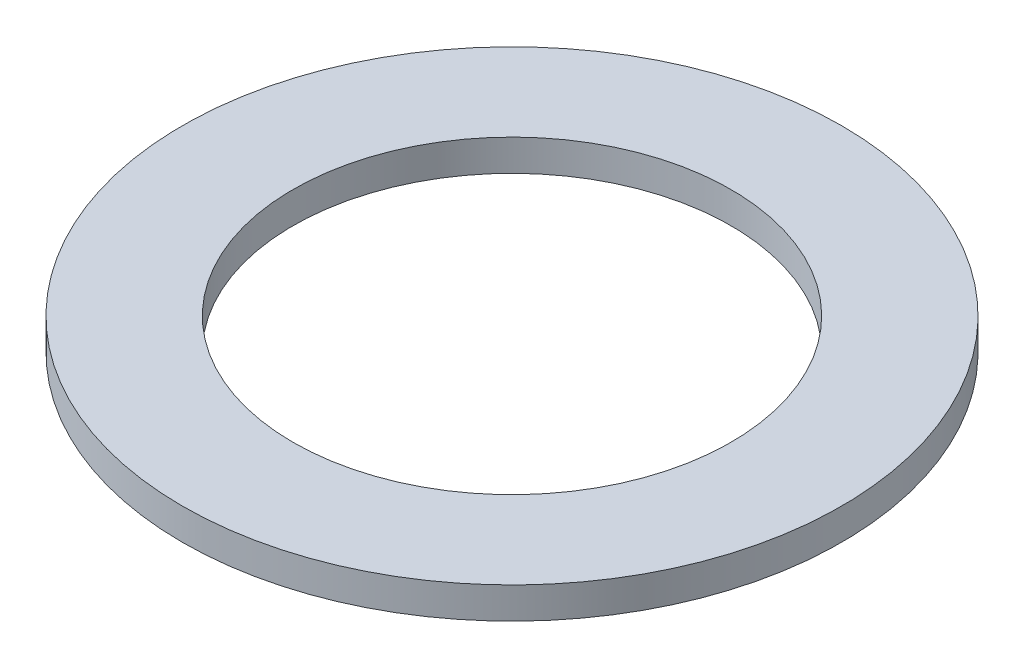
ISO-10303-21;
HEADER;
FILE_DESCRIPTION(('STEP AP214'),'2;1');
FILE_NAME('part.step','',(''),(''),'','','');
FILE_SCHEMA(('AUTOMOTIVE_DESIGN { 1 0 10303 214 1 1 1 1 }'));
ENDSEC;
DATA;
#1=APPLICATION_CONTEXT('core data for automotive mechanical design processes');
#2=APPLICATION_PROTOCOL_DEFINITION('international standard','automotive_design',2000,#1);
#3=PRODUCT_CONTEXT('',#1,'mechanical');
#4=PRODUCT('Part','Part','',(#3));
#5=PRODUCT_RELATED_PRODUCT_CATEGORY('part','',(#4));
#6=PRODUCT_DEFINITION_FORMATION('','',#4);
#7=PRODUCT_DEFINITION_CONTEXT('part definition',#1,'design');
#8=PRODUCT_DEFINITION('design','',#6,#7);
#9=PRODUCT_DEFINITION_SHAPE('','',#8);
#10=(LENGTH_UNIT() NAMED_UNIT(*) SI_UNIT(.MILLI.,.METRE.));
#11=(NAMED_UNIT(*) PLANE_ANGLE_UNIT() SI_UNIT($,.RADIAN.));
#12=(NAMED_UNIT(*) SI_UNIT($,.STERADIAN.) SOLID_ANGLE_UNIT());
#13=UNCERTAINTY_MEASURE_WITH_UNIT(LENGTH_MEASURE(1.E-05),#10,'distance_accuracy_value','');
#14=(GEOMETRIC_REPRESENTATION_CONTEXT(3) GLOBAL_UNCERTAINTY_ASSIGNED_CONTEXT((#13)) GLOBAL_UNIT_ASSIGNED_CONTEXT((#10,
#11,#12)) REPRESENTATION_CONTEXT('',''));
#15=CARTESIAN_POINT('',(0.,0.,0.));
#16=DIRECTION('',(0.,0.,1.));
#17=DIRECTION('',(1.,0.,0.));
#18=AXIS2_PLACEMENT_3D('',#15,#16,#17);
#19=CARTESIAN_POINT('',(0.,1.,0.));
#20=DIRECTION('',(0.,1.,0.));
#21=DIRECTION('',(0.,0.,1.));
#22=AXIS2_PLACEMENT_3D('',#19,#20,#21);
#23=PLANE('',#22);
#24=CARTESIAN_POINT('',(0.,1.,0.));
#25=DIRECTION('',(0.,1.,0.));
#26=DIRECTION('',(0.,0.,1.));
#27=AXIS2_PLACEMENT_3D('',#24,#25,#26);
#28=CIRCLE('',#27,10.499999939);
#29=CARTESIAN_POINT('',(0.,1.,10.499999939));
#30=VERTEX_POINT('',#29);
#31=EDGE_CURVE('E10',#30,#30,#28,.T.);
#32=ORIENTED_EDGE('',*,*,#31,.T.);
#33=EDGE_LOOP('',(#32));
#34=FACE_BOUND('',#33,.T.);
#35=CARTESIAN_POINT('',(0.,1.,0.));
#36=DIRECTION('',(0.,1.,0.));
#37=DIRECTION('',(0.,0.,1.));
#38=AXIS2_PLACEMENT_3D('',#35,#36,#37);
#39=CIRCLE('',#38,6.977);
#40=CARTESIAN_POINT('',(0.,1.,6.977));
#41=VERTEX_POINT('',#40);
#42=EDGE_CURVE('E50',#41,#41,#39,.T.);
#43=ORIENTED_EDGE('',*,*,#42,.F.);
#44=EDGE_LOOP('',(#43));
#45=FACE_BOUND('',#44,.T.);
#46=ADVANCED_FACE('F37',(#34,#45),#23,.T.);
#47=CARTESIAN_POINT('',(0.,0.,0.));
#48=DIRECTION('',(0.,1.,0.));
#49=DIRECTION('',(0.,0.,1.));
#50=AXIS2_PLACEMENT_3D('',#47,#48,#49);
#51=PLANE('',#50);
#52=CARTESIAN_POINT('',(0.,0.,0.));
#53=DIRECTION('',(0.,1.,0.));
#54=DIRECTION('',(0.,0.,1.));
#55=AXIS2_PLACEMENT_3D('',#52,#53,#54);
#56=CIRCLE('',#55,10.499999939);
#57=CARTESIAN_POINT('',(0.,0.,10.499999939));
#58=VERTEX_POINT('',#57);
#59=EDGE_CURVE('E41',#58,#58,#56,.T.);
#60=ORIENTED_EDGE('',*,*,#59,.F.);
#61=EDGE_LOOP('',(#60));
#62=FACE_BOUND('',#61,.T.);
#63=CARTESIAN_POINT('',(0.,0.,0.));
#64=DIRECTION('',(0.,1.,0.));
#65=DIRECTION('',(0.,0.,1.));
#66=AXIS2_PLACEMENT_3D('',#63,#64,#65);
#67=CIRCLE('',#66,6.977);
#68=CARTESIAN_POINT('',(0.,0.,6.977));
#69=VERTEX_POINT('',#68);
#70=EDGE_CURVE('E52',#69,#69,#67,.T.);
#71=ORIENTED_EDGE('',*,*,#70,.T.);
#72=EDGE_LOOP('',(#71));
#73=FACE_BOUND('',#72,.T.);
#74=ADVANCED_FACE('F64',(#62,#73),#51,.F.);
#75=CARTESIAN_POINT('',(0.,1.,0.));
#76=DIRECTION('',(0.,-1.,0.));
#77=DIRECTION('',(0.,0.,-1.));
#78=AXIS2_PLACEMENT_3D('',#75,#76,#77);
#79=CYLINDRICAL_SURFACE('',#78,10.499999939);
#80=ORIENTED_EDGE('',*,*,#31,.F.);
#81=EDGE_LOOP('',(#80));
#82=FACE_BOUND('',#81,.T.);
#83=ORIENTED_EDGE('',*,*,#59,.T.);
#84=EDGE_LOOP('',(#83));
#85=FACE_BOUND('',#84,.T.);
#86=ADVANCED_FACE('F39',(#82,#85),#79,.T.);
#87=CARTESIAN_POINT('',(0.,1.,0.));
#88=DIRECTION('',(0.,-1.,0.));
#89=DIRECTION('',(0.,0.,-1.));
#90=AXIS2_PLACEMENT_3D('',#87,#88,#89);
#91=CYLINDRICAL_SURFACE('',#90,6.977);
#92=ORIENTED_EDGE('',*,*,#42,.T.);
#93=EDGE_LOOP('',(#92));
#94=FACE_BOUND('',#93,.T.);
#95=ORIENTED_EDGE('',*,*,#70,.F.);
#96=EDGE_LOOP('',(#95));
#97=FACE_BOUND('',#96,.T.);
#98=ADVANCED_FACE('F60',(#94,#97),#91,.F.);
#99=CLOSED_SHELL('',(#46,#74,#86,#98));
#100=MANIFOLD_SOLID_BREP('B2',#99);
#101=ADVANCED_BREP_SHAPE_REPRESENTATION('',(#18,#100),#14);
#102=SHAPE_DEFINITION_REPRESENTATION(#9,#101);
ENDSEC;
END-ISO-10303-21;
